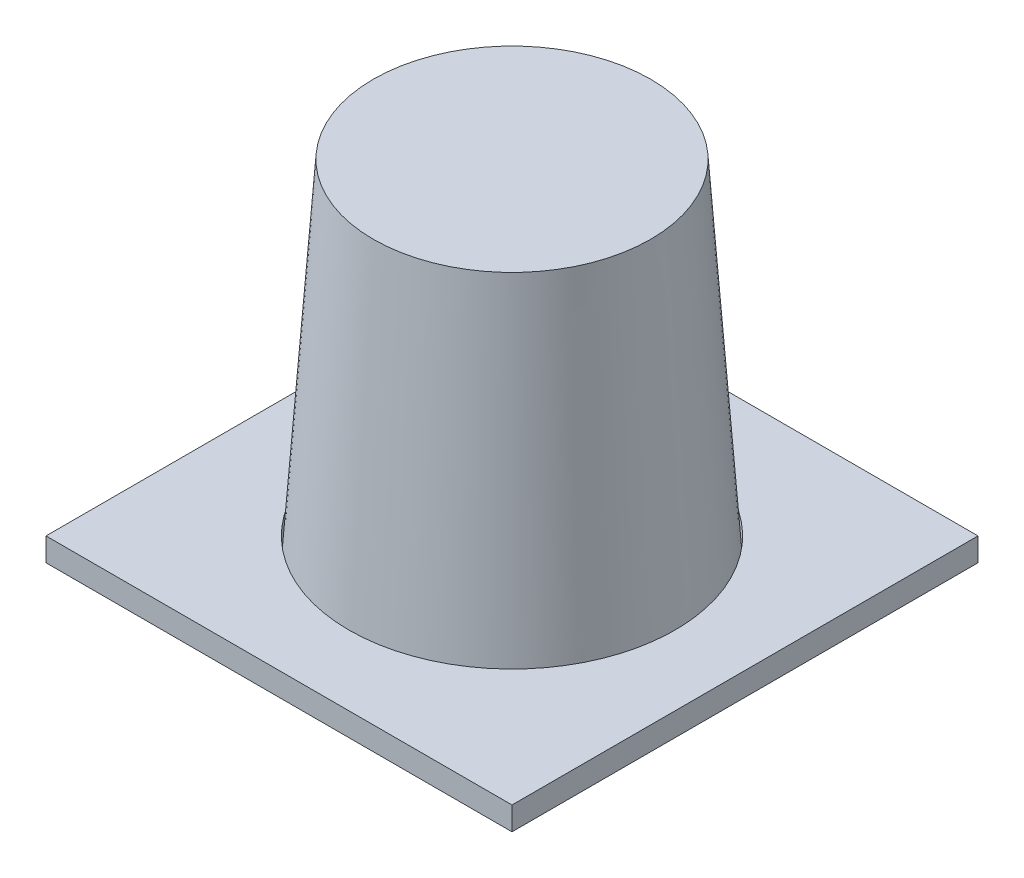
ISO-10303-21;
HEADER;
FILE_DESCRIPTION(('STEP AP214'),'2;1');
FILE_NAME('part.step','',(''),(''),'','','');
FILE_SCHEMA(('AUTOMOTIVE_DESIGN { 1 0 10303 214 1 1 1 1 }'));
ENDSEC;
DATA;
#1=APPLICATION_CONTEXT('core data for automotive mechanical design processes');
#2=APPLICATION_PROTOCOL_DEFINITION('international standard','automotive_design',2000,#1);
#3=PRODUCT_CONTEXT('',#1,'mechanical');
#4=PRODUCT('Part','Part','',(#3));
#5=PRODUCT_RELATED_PRODUCT_CATEGORY('part','',(#4));
#6=PRODUCT_DEFINITION_FORMATION('','',#4);
#7=PRODUCT_DEFINITION_CONTEXT('part definition',#1,'design');
#8=PRODUCT_DEFINITION('design','',#6,#7);
#9=PRODUCT_DEFINITION_SHAPE('','',#8);
#10=(LENGTH_UNIT() NAMED_UNIT(*) SI_UNIT(.MILLI.,.METRE.));
#11=(NAMED_UNIT(*) PLANE_ANGLE_UNIT() SI_UNIT($,.RADIAN.));
#12=(NAMED_UNIT(*) SI_UNIT($,.STERADIAN.) SOLID_ANGLE_UNIT());
#13=UNCERTAINTY_MEASURE_WITH_UNIT(LENGTH_MEASURE(1.E-05),#10,'distance_accuracy_value','');
#14=(GEOMETRIC_REPRESENTATION_CONTEXT(3) GLOBAL_UNCERTAINTY_ASSIGNED_CONTEXT((#13)) GLOBAL_UNIT_ASSIGNED_CONTEXT((#10,
#11,#12)) REPRESENTATION_CONTEXT('',''));
#15=CARTESIAN_POINT('',(0.,0.,0.));
#16=DIRECTION('',(0.,0.,1.));
#17=DIRECTION('',(1.,0.,0.));
#18=AXIS2_PLACEMENT_3D('',#15,#16,#17);
#19=CARTESIAN_POINT('',(0.,2.,0.));
#20=DIRECTION('',(0.,1.,0.));
#21=DIRECTION('',(0.,0.,1.));
#22=AXIS2_PLACEMENT_3D('',#19,#20,#21);
#23=PLANE('',#22);
#24=DIRECTION('',(0.,0.,-1.));
#25=VECTOR('',#24,1.);
#26=CARTESIAN_POINT('',(20.,2.,-20.));
#27=LINE('',#26,#25);
#28=CARTESIAN_POINT('',(20.,2.,20.));
#29=VERTEX_POINT('',#28);
#30=CARTESIAN_POINT('',(20.,2.,-20.));
#31=VERTEX_POINT('',#30);
#32=EDGE_CURVE('E103',#29,#31,#27,.T.);
#33=ORIENTED_EDGE('',*,*,#32,.T.);
#34=DIRECTION('',(-1.,0.,0.));
#35=VECTOR('',#34,1.);
#36=CARTESIAN_POINT('',(-20.,2.,-20.));
#37=LINE('',#36,#35);
#38=CARTESIAN_POINT('',(-20.,2.,-20.));
#39=VERTEX_POINT('',#38);
#40=EDGE_CURVE('E98',#31,#39,#37,.T.);
#41=ORIENTED_EDGE('',*,*,#40,.T.);
#42=DIRECTION('',(0.,0.,1.));
#43=VECTOR('',#42,1.);
#44=CARTESIAN_POINT('',(-20.,2.,-20.));
#45=LINE('',#44,#43);
#46=CARTESIAN_POINT('',(-20.,2.,20.));
#47=VERTEX_POINT('',#46);
#48=EDGE_CURVE('E101',#39,#47,#45,.T.);
#49=ORIENTED_EDGE('',*,*,#48,.T.);
#50=DIRECTION('',(1.,0.,0.));
#51=VECTOR('',#50,1.);
#52=CARTESIAN_POINT('',(-20.,2.,20.));
#53=LINE('',#52,#51);
#54=EDGE_CURVE('E68',#47,#29,#53,.T.);
#55=ORIENTED_EDGE('',*,*,#54,.T.);
#56=EDGE_LOOP('',(#33,#41,#49,#55));
#57=FACE_BOUND('',#56,.T.);
#58=CARTESIAN_POINT('',(0.,2.,0.));
#59=DIRECTION('',(0.,1.,0.));
#60=DIRECTION('',(0.,0.,1.));
#61=AXIS2_PLACEMENT_3D('',#58,#59,#60);
#62=CIRCLE('',#61,14.);
#63=CARTESIAN_POINT('',(0.,2.,14.));
#64=VERTEX_POINT('',#63);
#65=EDGE_CURVE('E118',#64,#64,#62,.T.);
#66=ORIENTED_EDGE('',*,*,#65,.F.);
#67=EDGE_LOOP('',(#66));
#68=FACE_BOUND('',#67,.T.);
#69=ADVANCED_FACE('F51',(#57,#68),#23,.T.);
#70=CARTESIAN_POINT('',(0.,0.,0.));
#71=DIRECTION('',(0.,1.,0.));
#72=DIRECTION('',(0.,0.,1.));
#73=AXIS2_PLACEMENT_3D('',#70,#71,#72);
#74=PLANE('',#73);
#75=DIRECTION('',(0.,0.,-1.));
#76=VECTOR('',#75,1.);
#77=CARTESIAN_POINT('',(20.,0.,-20.));
#78=LINE('',#77,#76);
#79=CARTESIAN_POINT('',(20.,0.,20.));
#80=VERTEX_POINT('',#79);
#81=CARTESIAN_POINT('',(20.,0.,-20.));
#82=VERTEX_POINT('',#81);
#83=EDGE_CURVE('E115',#80,#82,#78,.T.);
#84=ORIENTED_EDGE('',*,*,#83,.F.);
#85=DIRECTION('',(1.,0.,0.));
#86=VECTOR('',#85,1.);
#87=CARTESIAN_POINT('',(-20.,0.,20.));
#88=LINE('',#87,#86);
#89=CARTESIAN_POINT('',(-20.,0.,20.));
#90=VERTEX_POINT('',#89);
#91=EDGE_CURVE('E91',#90,#80,#88,.T.);
#92=ORIENTED_EDGE('',*,*,#91,.F.);
#93=DIRECTION('',(0.,0.,1.));
#94=VECTOR('',#93,1.);
#95=CARTESIAN_POINT('',(-20.,0.,-20.));
#96=LINE('',#95,#94);
#97=CARTESIAN_POINT('',(-20.,0.,-20.));
#98=VERTEX_POINT('',#97);
#99=EDGE_CURVE('E85',#98,#90,#96,.T.);
#100=ORIENTED_EDGE('',*,*,#99,.F.);
#101=DIRECTION('',(-1.,0.,0.));
#102=VECTOR('',#101,1.);
#103=CARTESIAN_POINT('',(-20.,0.,-20.));
#104=LINE('',#103,#102);
#105=EDGE_CURVE('E107',#82,#98,#104,.T.);
#106=ORIENTED_EDGE('',*,*,#105,.F.);
#107=EDGE_LOOP('',(#84,#92,#100,#106));
#108=FACE_BOUND('',#107,.T.);
#109=CARTESIAN_POINT('',(0.,0.,0.));
#110=DIRECTION('',(0.,1.,0.));
#111=DIRECTION('',(0.,0.,1.));
#112=AXIS2_PLACEMENT_3D('',#109,#110,#111);
#113=CIRCLE('',#112,14.);
#114=CARTESIAN_POINT('',(0.,0.,14.));
#115=VERTEX_POINT('',#114);
#116=EDGE_CURVE('E130',#115,#115,#113,.T.);
#117=ORIENTED_EDGE('',*,*,#116,.T.);
#118=EDGE_LOOP('',(#117));
#119=FACE_BOUND('',#118,.T.);
#120=ADVANCED_FACE('F126',(#108,#119),#74,.F.);
#121=CARTESIAN_POINT('',(20.,2.,-20.));
#122=DIRECTION('',(-1.,0.,0.));
#123=DIRECTION('',(0.,0.,1.));
#124=AXIS2_PLACEMENT_3D('',#121,#122,#123);
#125=PLANE('',#124);
#126=ORIENTED_EDGE('',*,*,#83,.T.);
#127=DIRECTION('',(0.,-1.,0.));
#128=VECTOR('',#127,1.);
#129=CARTESIAN_POINT('',(20.,2.,-20.));
#130=LINE('',#129,#128);
#131=EDGE_CURVE('E12',#31,#82,#130,.T.);
#132=ORIENTED_EDGE('',*,*,#131,.F.);
#133=ORIENTED_EDGE('',*,*,#32,.F.);
#134=DIRECTION('',(0.,-1.,0.));
#135=VECTOR('',#134,1.);
#136=CARTESIAN_POINT('',(20.,2.,20.));
#137=LINE('',#136,#135);
#138=EDGE_CURVE('E111',#29,#80,#137,.T.);
#139=ORIENTED_EDGE('',*,*,#138,.T.);
#140=EDGE_LOOP('',(#126,#132,#133,#139));
#141=FACE_BOUND('',#140,.T.);
#142=ADVANCED_FACE('F53',(#141),#125,.F.);
#143=CARTESIAN_POINT('',(-20.,2.,-20.));
#144=DIRECTION('',(0.,0.,1.));
#145=DIRECTION('',(1.,0.,0.));
#146=AXIS2_PLACEMENT_3D('',#143,#144,#145);
#147=PLANE('',#146);
#148=ORIENTED_EDGE('',*,*,#105,.T.);
#149=DIRECTION('',(0.,-1.,0.));
#150=VECTOR('',#149,1.);
#151=CARTESIAN_POINT('',(-20.,2.,-20.));
#152=LINE('',#151,#150);
#153=EDGE_CURVE('E60',#39,#98,#152,.T.);
#154=ORIENTED_EDGE('',*,*,#153,.F.);
#155=ORIENTED_EDGE('',*,*,#40,.F.);
#156=ORIENTED_EDGE('',*,*,#131,.T.);
#157=EDGE_LOOP('',(#148,#154,#155,#156));
#158=FACE_BOUND('',#157,.T.);
#159=ADVANCED_FACE('F106',(#158),#147,.F.);
#160=CARTESIAN_POINT('',(-20.,2.,-20.));
#161=DIRECTION('',(1.,0.,0.));
#162=DIRECTION('',(0.,0.,-1.));
#163=AXIS2_PLACEMENT_3D('',#160,#161,#162);
#164=PLANE('',#163);
#165=ORIENTED_EDGE('',*,*,#99,.T.);
#166=DIRECTION('',(0.,-1.,0.));
#167=VECTOR('',#166,1.);
#168=CARTESIAN_POINT('',(-20.,2.,20.));
#169=LINE('',#168,#167);
#170=EDGE_CURVE('E108',#47,#90,#169,.T.);
#171=ORIENTED_EDGE('',*,*,#170,.F.);
#172=ORIENTED_EDGE('',*,*,#48,.F.);
#173=ORIENTED_EDGE('',*,*,#153,.T.);
#174=EDGE_LOOP('',(#165,#171,#172,#173));
#175=FACE_BOUND('',#174,.T.);
#176=ADVANCED_FACE('F109',(#175),#164,.F.);
#177=CARTESIAN_POINT('',(-20.,2.,20.));
#178=DIRECTION('',(0.,0.,-1.));
#179=DIRECTION('',(-1.,0.,0.));
#180=AXIS2_PLACEMENT_3D('',#177,#178,#179);
#181=PLANE('',#180);
#182=ORIENTED_EDGE('',*,*,#91,.T.);
#183=ORIENTED_EDGE('',*,*,#138,.F.);
#184=ORIENTED_EDGE('',*,*,#54,.F.);
#185=ORIENTED_EDGE('',*,*,#170,.T.);
#186=EDGE_LOOP('',(#182,#183,#184,#185));
#187=FACE_BOUND('',#186,.T.);
#188=ADVANCED_FACE('F123',(#187),#181,.F.);
#189=CARTESIAN_POINT('',(0.,2.,0.));
#190=DIRECTION('',(0.,-1.,0.));
#191=DIRECTION('',(0.,0.,-1.));
#192=AXIS2_PLACEMENT_3D('',#189,#190,#191);
#193=CYLINDRICAL_SURFACE('',#192,14.);
#194=ORIENTED_EDGE('',*,*,#65,.T.);
#195=EDGE_LOOP('',(#194));
#196=FACE_BOUND('',#195,.T.);
#197=ORIENTED_EDGE('',*,*,#116,.F.);
#198=EDGE_LOOP('',(#197));
#199=FACE_BOUND('',#198,.T.);
#200=ADVANCED_FACE('F136',(#196,#199),#193,.F.);
#201=CLOSED_SHELL('',(#69,#120,#142,#159,#176,#188,#200));
#202=MANIFOLD_SOLID_BREP('B2',#201);
#203=CARTESIAN_POINT('',(0.,0.,0.));
#204=DIRECTION('',(0.,-1.,0.));
#205=DIRECTION('',(0.,0.,1.));
#206=AXIS2_PLACEMENT_3D('',#203,#204,#205);
#207=CONICAL_SURFACE('',#206,14.,0.0698131700797732);
#208=CARTESIAN_POINT('',(0.,30.,0.));
#209=DIRECTION('',(0.,1.,0.));
#210=DIRECTION('',(0.,0.,1.));
#211=AXIS2_PLACEMENT_3D('',#208,#209,#210);
#212=CIRCLE('',#211,11.9021956416947);
#213=CARTESIAN_POINT('',(0.,30.,11.9021956416947));
#214=VERTEX_POINT('',#213);
#215=EDGE_CURVE('E50',#214,#214,#212,.T.);
#216=ORIENTED_EDGE('',*,*,#215,.F.);
#217=EDGE_LOOP('',(#216));
#218=FACE_BOUND('',#217,.T.);
#219=CARTESIAN_POINT('',(0.,0.,0.));
#220=DIRECTION('',(0.,1.,0.));
#221=DIRECTION('',(0.,0.,1.));
#222=AXIS2_PLACEMENT_3D('',#219,#220,#221);
#223=CIRCLE('',#222,14.);
#224=CARTESIAN_POINT('',(0.,0.,14.));
#225=VERTEX_POINT('',#224);
#226=EDGE_CURVE('E202',#225,#225,#223,.T.);
#227=ORIENTED_EDGE('',*,*,#226,.T.);
#228=EDGE_LOOP('',(#227));
#229=FACE_BOUND('',#228,.T.);
#230=ADVANCED_FACE('F196',(#218,#229),#207,.T.);
#231=CARTESIAN_POINT('',(0.,30.,0.));
#232=DIRECTION('',(0.,1.,0.));
#233=DIRECTION('',(0.,0.,1.));
#234=AXIS2_PLACEMENT_3D('',#231,#232,#233);
#235=PLANE('',#234);
#236=ORIENTED_EDGE('',*,*,#215,.T.);
#237=EDGE_LOOP('',(#236));
#238=FACE_BOUND('',#237,.T.);
#239=ADVANCED_FACE('F211',(#238),#235,.T.);
#240=CARTESIAN_POINT('',(0.,0.,0.));
#241=DIRECTION('',(0.,1.,0.));
#242=DIRECTION('',(0.,0.,1.));
#243=AXIS2_PLACEMENT_3D('',#240,#241,#242);
#244=PLANE('',#243);
#245=ORIENTED_EDGE('',*,*,#226,.F.);
#246=EDGE_LOOP('',(#245));
#247=FACE_BOUND('',#246,.T.);
#248=ADVANCED_FACE('F209',(#247),#244,.F.);
#249=CLOSED_SHELL('',(#230,#239,#248));
#250=MANIFOLD_SOLID_BREP('B6',#249);
#251=ADVANCED_BREP_SHAPE_REPRESENTATION('',(#18,#202,#250),#14);
#252=SHAPE_DEFINITION_REPRESENTATION(#9,#251);
ENDSEC;
END-ISO-10303-21;
